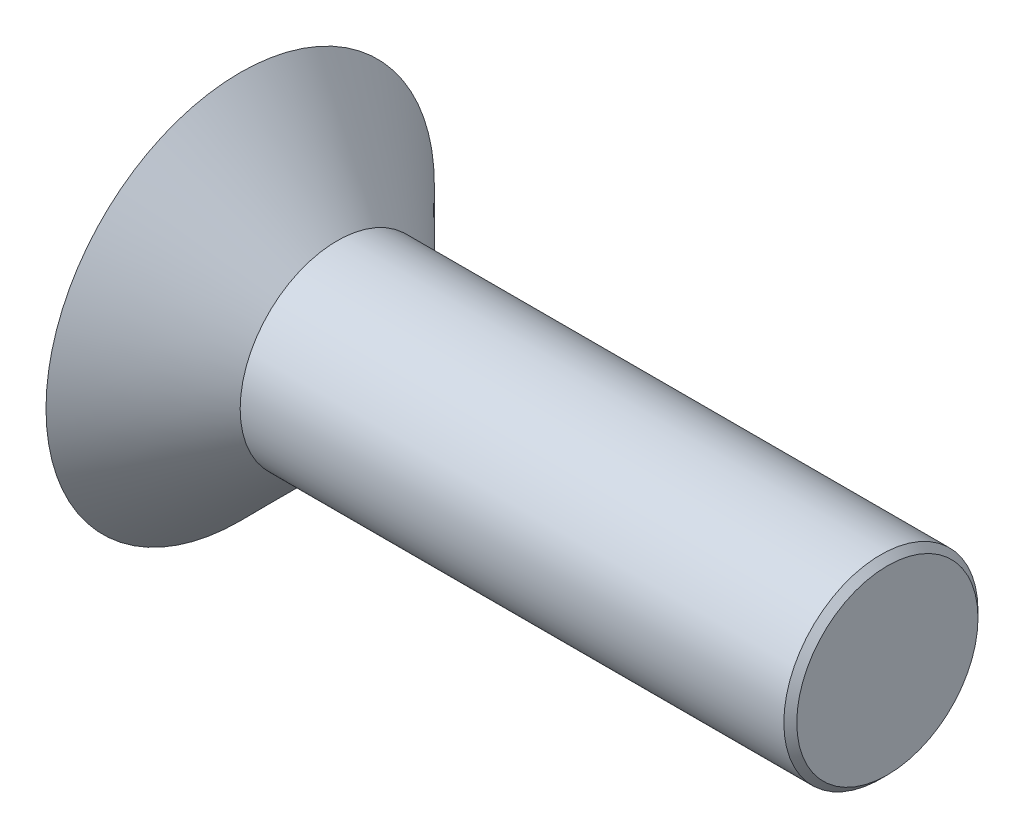
ISO-10303-21;
HEADER;
FILE_DESCRIPTION(('STEP AP214'),'2;1');
FILE_NAME('part.step','',(''),(''),'','','');
FILE_SCHEMA(('AUTOMOTIVE_DESIGN { 1 0 10303 214 1 1 1 1 }'));
ENDSEC;
DATA;
#1=APPLICATION_CONTEXT('core data for automotive mechanical design processes');
#2=APPLICATION_PROTOCOL_DEFINITION('international standard','automotive_design',2000,#1);
#3=PRODUCT_CONTEXT('',#1,'mechanical');
#4=PRODUCT('Part','Part','',(#3));
#5=PRODUCT_RELATED_PRODUCT_CATEGORY('part','',(#4));
#6=PRODUCT_DEFINITION_FORMATION('','',#4);
#7=PRODUCT_DEFINITION_CONTEXT('part definition',#1,'design');
#8=PRODUCT_DEFINITION('design','',#6,#7);
#9=PRODUCT_DEFINITION_SHAPE('','',#8);
#10=(LENGTH_UNIT() NAMED_UNIT(*) SI_UNIT(.MILLI.,.METRE.));
#11=(NAMED_UNIT(*) PLANE_ANGLE_UNIT() SI_UNIT($,.RADIAN.));
#12=(NAMED_UNIT(*) SI_UNIT($,.STERADIAN.) SOLID_ANGLE_UNIT());
#13=UNCERTAINTY_MEASURE_WITH_UNIT(LENGTH_MEASURE(1.E-05),#10,'distance_accuracy_value','');
#14=(GEOMETRIC_REPRESENTATION_CONTEXT(3) GLOBAL_UNCERTAINTY_ASSIGNED_CONTEXT((#13)) GLOBAL_UNIT_ASSIGNED_CONTEXT((#10,
#11,#12)) REPRESENTATION_CONTEXT('',''));
#15=CARTESIAN_POINT('',(0.,0.,0.));
#16=DIRECTION('',(0.,0.,1.));
#17=DIRECTION('',(1.,0.,0.));
#18=AXIS2_PLACEMENT_3D('',#15,#16,#17);
#19=CARTESIAN_POINT('',(0.,0.,0.));
#20=DIRECTION('',(1.,0.,0.));
#21=DIRECTION('',(0.,0.,1.));
#22=AXIS2_PLACEMENT_3D('',#19,#20,#21);
#23=PLANE('',#22);
#24=DIRECTION('',(0.,0.866025403784439,0.5));
#25=VECTOR('',#24,1.);
#26=CARTESIAN_POINT('',(0.,0.,-1.44337567297406));
#27=LINE('',#26,#25);
#28=CARTESIAN_POINT('',(0.,0.,-1.44337567297407));
#29=VERTEX_POINT('',#28);
#30=CARTESIAN_POINT('',(0.,1.25,-0.721687836487031));
#31=VERTEX_POINT('',#30);
#32=EDGE_CURVE('E259',#29,#31,#27,.T.);
#33=ORIENTED_EDGE('',*,*,#32,.T.);
#34=DIRECTION('',(0.,0.,1.));
#35=VECTOR('',#34,1.);
#36=CARTESIAN_POINT('',(0.,1.25,-0.721687836487031));
#37=LINE('',#36,#35);
#38=CARTESIAN_POINT('',(0.,1.25,0.721687836487033));
#39=VERTEX_POINT('',#38);
#40=EDGE_CURVE('E255',#31,#39,#37,.T.);
#41=ORIENTED_EDGE('',*,*,#40,.T.);
#42=DIRECTION('',(0.,-0.866025403784439,0.5));
#43=VECTOR('',#42,1.);
#44=CARTESIAN_POINT('',(0.,1.25,0.721687836487033));
#45=LINE('',#44,#43);
#46=CARTESIAN_POINT('',(0.,0.,1.44337567297407));
#47=VERTEX_POINT('',#46);
#48=EDGE_CURVE('E253',#39,#47,#45,.T.);
#49=ORIENTED_EDGE('',*,*,#48,.T.);
#50=DIRECTION('',(0.,-0.866025403784438,-0.5));
#51=VECTOR('',#50,1.);
#52=CARTESIAN_POINT('',(0.,0.,1.44337567297407));
#53=LINE('',#52,#51);
#54=CARTESIAN_POINT('',(0.,-1.25,0.721687836487033));
#55=VERTEX_POINT('',#54);
#56=EDGE_CURVE('E115',#47,#55,#53,.T.);
#57=ORIENTED_EDGE('',*,*,#56,.T.);
#58=DIRECTION('',(0.,0.,-1.));
#59=VECTOR('',#58,1.);
#60=CARTESIAN_POINT('',(0.,-1.25,0.721687836487033));
#61=LINE('',#60,#59);
#62=CARTESIAN_POINT('',(0.,-1.25,-0.721687836487032));
#63=VERTEX_POINT('',#62);
#64=EDGE_CURVE('E247',#55,#63,#61,.T.);
#65=ORIENTED_EDGE('',*,*,#64,.T.);
#66=DIRECTION('',(0.,0.866025403784438,-0.5));
#67=VECTOR('',#66,1.);
#68=CARTESIAN_POINT('',(0.,-1.25,-0.721687836487032));
#69=LINE('',#68,#67);
#70=EDGE_CURVE('E261',#63,#29,#69,.T.);
#71=ORIENTED_EDGE('',*,*,#70,.T.);
#72=EDGE_LOOP('',(#33,#41,#49,#57,#65,#71));
#73=FACE_BOUND('',#72,.T.);
#74=CARTESIAN_POINT('',(0.,0.,0.));
#75=DIRECTION('',(1.,0.,0.));
#76=DIRECTION('',(0.,0.,-1.));
#77=AXIS2_PLACEMENT_3D('',#74,#75,#76);
#78=CIRCLE('',#77,3.);
#79=CARTESIAN_POINT('',(0.,0.,-3.));
#80=VERTEX_POINT('',#79);
#81=EDGE_CURVE('E129',#80,#80,#78,.T.);
#82=ORIENTED_EDGE('',*,*,#81,.F.);
#83=EDGE_LOOP('',(#82));
#84=FACE_BOUND('',#83,.T.);
#85=ADVANCED_FACE('F37',(#73,#84),#23,.F.);
#86=CARTESIAN_POINT('',(1.49999999999999,0.,0.));
#87=DIRECTION('',(-1.,0.,0.));
#88=DIRECTION('',(0.,0.,-1.));
#89=AXIS2_PLACEMENT_3D('',#86,#87,#88);
#90=CONICAL_SURFACE('',#89,1.5,0.78539816339745);
#91=ORIENTED_EDGE('',*,*,#81,.T.);
#92=EDGE_LOOP('',(#91));
#93=FACE_BOUND('',#92,.T.);
#94=CARTESIAN_POINT('',(1.49999999999999,0.,0.));
#95=DIRECTION('',(1.,0.,0.));
#96=DIRECTION('',(0.,0.,-1.));
#97=AXIS2_PLACEMENT_3D('',#94,#95,#96);
#98=CIRCLE('',#97,1.5);
#99=CARTESIAN_POINT('',(1.49999999999999,0.,-1.5));
#100=VERTEX_POINT('',#99);
#101=EDGE_CURVE('E126',#100,#100,#98,.T.);
#102=ORIENTED_EDGE('',*,*,#101,.F.);
#103=EDGE_LOOP('',(#102));
#104=FACE_BOUND('',#103,.T.);
#105=ADVANCED_FACE('F139',(#93,#104),#90,.T.);
#106=CARTESIAN_POINT('',(0.,0.,0.));
#107=DIRECTION('',(-1.,0.,0.));
#108=DIRECTION('',(0.,0.,-1.));
#109=AXIS2_PLACEMENT_3D('',#106,#107,#108);
#110=CYLINDRICAL_SURFACE('',#109,1.5);
#111=CARTESIAN_POINT('',(9.9,0.,0.));
#112=DIRECTION('',(1.,0.,0.));
#113=DIRECTION('',(0.,0.,-1.));
#114=AXIS2_PLACEMENT_3D('',#111,#112,#113);
#115=CIRCLE('',#114,1.5);
#116=CARTESIAN_POINT('',(9.9,0.,-1.5));
#117=VERTEX_POINT('',#116);
#118=EDGE_CURVE('E45',#117,#117,#115,.T.);
#119=ORIENTED_EDGE('',*,*,#118,.F.);
#120=EDGE_LOOP('',(#119));
#121=FACE_BOUND('',#120,.T.);
#122=ORIENTED_EDGE('',*,*,#101,.T.);
#123=EDGE_LOOP('',(#122));
#124=FACE_BOUND('',#123,.T.);
#125=ADVANCED_FACE('F135',(#121,#124),#110,.T.);
#126=CARTESIAN_POINT('',(10.,0.,1.5));
#127=DIRECTION('',(-1.,0.,0.));
#128=DIRECTION('',(0.,0.,-1.));
#129=AXIS2_PLACEMENT_3D('',#126,#127,#128);
#130=PLANE('',#129);
#131=CARTESIAN_POINT('',(10.,0.,0.));
#132=DIRECTION('',(1.,0.,0.));
#133=DIRECTION('',(0.,0.,-1.));
#134=AXIS2_PLACEMENT_3D('',#131,#132,#133);
#135=CIRCLE('',#134,1.4);
#136=CARTESIAN_POINT('',(10.,0.,-1.4));
#137=VERTEX_POINT('',#136);
#138=EDGE_CURVE('E11',#137,#137,#135,.F.);
#139=ORIENTED_EDGE('',*,*,#138,.F.);
#140=EDGE_LOOP('',(#139));
#141=FACE_BOUND('',#140,.T.);
#142=ADVANCED_FACE('F138',(#141),#130,.F.);
#143=CARTESIAN_POINT('',(1.2,-1.25,-0.721687836487032));
#144=DIRECTION('',(0.,-0.5,-0.866025403784439));
#145=DIRECTION('',(0.,-0.866025403784439,0.5));
#146=AXIS2_PLACEMENT_3D('',#143,#144,#145);
#147=PLANE('',#146);
#148=ORIENTED_EDGE('',*,*,#70,.F.);
#149=DIRECTION('',(-1.,0.,0.));
#150=VECTOR('',#149,1.);
#151=CARTESIAN_POINT('',(1.2,-1.25,-0.721687836487032));
#152=LINE('',#151,#150);
#153=CARTESIAN_POINT('',(1.2,-1.25,-0.721687836487032));
#154=VERTEX_POINT('',#153);
#155=EDGE_CURVE('E83',#154,#63,#152,.T.);
#156=ORIENTED_EDGE('',*,*,#155,.F.);
#157=DIRECTION('',(0.,0.866025403784438,-0.5));
#158=VECTOR('',#157,1.);
#159=CARTESIAN_POINT('',(1.2,-1.25,-0.721687836487032));
#160=LINE('',#159,#158);
#161=CARTESIAN_POINT('',(1.2,0.,-1.44337567297406));
#162=VERTEX_POINT('',#161);
#163=EDGE_CURVE('E248',#154,#162,#160,.T.);
#164=ORIENTED_EDGE('',*,*,#163,.T.);
#165=DIRECTION('',(-1.,0.,0.));
#166=VECTOR('',#165,1.);
#167=CARTESIAN_POINT('',(1.2,0.,-1.44337567297406));
#168=LINE('',#167,#166);
#169=EDGE_CURVE('E52',#162,#29,#168,.T.);
#170=ORIENTED_EDGE('',*,*,#169,.T.);
#171=EDGE_LOOP('',(#148,#156,#164,#170));
#172=FACE_BOUND('',#171,.T.);
#173=ADVANCED_FACE('F153',(#172),#147,.F.);
#174=CARTESIAN_POINT('',(1.2,-1.25,0.721687836487033));
#175=DIRECTION('',(0.,-1.,0.));
#176=DIRECTION('',(0.,0.,1.));
#177=AXIS2_PLACEMENT_3D('',#174,#175,#176);
#178=PLANE('',#177);
#179=ORIENTED_EDGE('',*,*,#64,.F.);
#180=DIRECTION('',(-1.,0.,0.));
#181=VECTOR('',#180,1.);
#182=CARTESIAN_POINT('',(1.2,-1.25,0.721687836487033));
#183=LINE('',#182,#181);
#184=CARTESIAN_POINT('',(1.2,-1.25,0.721687836487033));
#185=VERTEX_POINT('',#184);
#186=EDGE_CURVE('E117',#185,#55,#183,.T.);
#187=ORIENTED_EDGE('',*,*,#186,.F.);
#188=DIRECTION('',(0.,0.,-1.));
#189=VECTOR('',#188,1.);
#190=CARTESIAN_POINT('',(1.2,-1.25,0.721687836487033));
#191=LINE('',#190,#189);
#192=EDGE_CURVE('E61',#185,#154,#191,.T.);
#193=ORIENTED_EDGE('',*,*,#192,.T.);
#194=ORIENTED_EDGE('',*,*,#155,.T.);
#195=EDGE_LOOP('',(#179,#187,#193,#194));
#196=FACE_BOUND('',#195,.T.);
#197=ADVANCED_FACE('F157',(#196),#178,.F.);
#198=CARTESIAN_POINT('',(1.2,0.,1.44337567297407));
#199=DIRECTION('',(0.,-0.5,0.866025403784439));
#200=DIRECTION('',(0.,0.866025403784439,0.5));
#201=AXIS2_PLACEMENT_3D('',#198,#199,#200);
#202=PLANE('',#201);
#203=ORIENTED_EDGE('',*,*,#56,.F.);
#204=DIRECTION('',(-1.,0.,0.));
#205=VECTOR('',#204,1.);
#206=CARTESIAN_POINT('',(1.2,0.,1.44337567297407));
#207=LINE('',#206,#205);
#208=CARTESIAN_POINT('',(1.2,0.,1.44337567297407));
#209=VERTEX_POINT('',#208);
#210=EDGE_CURVE('E104',#209,#47,#207,.T.);
#211=ORIENTED_EDGE('',*,*,#210,.F.);
#212=DIRECTION('',(0.,-0.866025403784438,-0.5));
#213=VECTOR('',#212,1.);
#214=CARTESIAN_POINT('',(1.2,0.,1.44337567297407));
#215=LINE('',#214,#213);
#216=EDGE_CURVE('E107',#209,#185,#215,.T.);
#217=ORIENTED_EDGE('',*,*,#216,.T.);
#218=ORIENTED_EDGE('',*,*,#186,.T.);
#219=EDGE_LOOP('',(#203,#211,#217,#218));
#220=FACE_BOUND('',#219,.T.);
#221=ADVANCED_FACE('F113',(#220),#202,.F.);
#222=CARTESIAN_POINT('',(1.2,1.25,0.721687836487033));
#223=DIRECTION('',(0.,0.5,0.866025403784439));
#224=DIRECTION('',(0.,0.866025403784439,-0.5));
#225=AXIS2_PLACEMENT_3D('',#222,#223,#224);
#226=PLANE('',#225);
#227=ORIENTED_EDGE('',*,*,#48,.F.);
#228=DIRECTION('',(-1.,0.,0.));
#229=VECTOR('',#228,1.);
#230=CARTESIAN_POINT('',(1.2,1.25,0.721687836487033));
#231=LINE('',#230,#229);
#232=CARTESIAN_POINT('',(1.2,1.25,0.721687836487033));
#233=VERTEX_POINT('',#232);
#234=EDGE_CURVE('E106',#233,#39,#231,.T.);
#235=ORIENTED_EDGE('',*,*,#234,.F.);
#236=DIRECTION('',(0.,-0.866025403784439,0.5));
#237=VECTOR('',#236,1.);
#238=CARTESIAN_POINT('',(1.2,1.25,0.721687836487033));
#239=LINE('',#238,#237);
#240=EDGE_CURVE('E99',#233,#209,#239,.T.);
#241=ORIENTED_EDGE('',*,*,#240,.T.);
#242=ORIENTED_EDGE('',*,*,#210,.T.);
#243=EDGE_LOOP('',(#227,#235,#241,#242));
#244=FACE_BOUND('',#243,.T.);
#245=ADVANCED_FACE('F102',(#244),#226,.F.);
#246=CARTESIAN_POINT('',(1.2,1.25,-0.721687836487031));
#247=DIRECTION('',(0.,1.,0.));
#248=DIRECTION('',(0.,0.,-1.));
#249=AXIS2_PLACEMENT_3D('',#246,#247,#248);
#250=PLANE('',#249);
#251=ORIENTED_EDGE('',*,*,#40,.F.);
#252=DIRECTION('',(-1.,0.,0.));
#253=VECTOR('',#252,1.);
#254=CARTESIAN_POINT('',(1.2,1.25,-0.721687836487031));
#255=LINE('',#254,#253);
#256=CARTESIAN_POINT('',(1.2,1.25,-0.721687836487031));
#257=VERTEX_POINT('',#256);
#258=EDGE_CURVE('E120',#257,#31,#255,.T.);
#259=ORIENTED_EDGE('',*,*,#258,.F.);
#260=DIRECTION('',(0.,0.,1.));
#261=VECTOR('',#260,1.);
#262=CARTESIAN_POINT('',(1.2,1.25,-0.721687836487031));
#263=LINE('',#262,#261);
#264=EDGE_CURVE('E108',#257,#233,#263,.T.);
#265=ORIENTED_EDGE('',*,*,#264,.T.);
#266=ORIENTED_EDGE('',*,*,#234,.T.);
#267=EDGE_LOOP('',(#251,#259,#265,#266));
#268=FACE_BOUND('',#267,.T.);
#269=ADVANCED_FACE('F161',(#268),#250,.F.);
#270=CARTESIAN_POINT('',(1.2,0.,-1.44337567297406));
#271=DIRECTION('',(0.,0.5,-0.866025403784438));
#272=DIRECTION('',(0.,-0.866025403784439,-0.5));
#273=AXIS2_PLACEMENT_3D('',#270,#271,#272);
#274=PLANE('',#273);
#275=ORIENTED_EDGE('',*,*,#32,.F.);
#276=ORIENTED_EDGE('',*,*,#169,.F.);
#277=DIRECTION('',(0.,0.866025403784439,0.5));
#278=VECTOR('',#277,1.);
#279=CARTESIAN_POINT('',(1.2,0.,-1.44337567297406));
#280=LINE('',#279,#278);
#281=EDGE_CURVE('E90',#162,#257,#280,.T.);
#282=ORIENTED_EDGE('',*,*,#281,.T.);
#283=ORIENTED_EDGE('',*,*,#258,.T.);
#284=EDGE_LOOP('',(#275,#276,#282,#283));
#285=FACE_BOUND('',#284,.T.);
#286=ADVANCED_FACE('F158',(#285),#274,.F.);
#287=CARTESIAN_POINT('',(1.2,0.,0.));
#288=DIRECTION('',(-1.,0.,0.));
#289=DIRECTION('',(0.,0.,-1.));
#290=AXIS2_PLACEMENT_3D('',#287,#288,#289);
#291=PLANE('',#290);
#292=ORIENTED_EDGE('',*,*,#163,.F.);
#293=ORIENTED_EDGE('',*,*,#192,.F.);
#294=ORIENTED_EDGE('',*,*,#216,.F.);
#295=ORIENTED_EDGE('',*,*,#240,.F.);
#296=ORIENTED_EDGE('',*,*,#264,.F.);
#297=ORIENTED_EDGE('',*,*,#281,.F.);
#298=EDGE_LOOP('',(#292,#293,#294,#295,#296,#297));
#299=FACE_BOUND('',#298,.T.);
#300=ADVANCED_FACE('F110',(#299),#291,.T.);
#301=CARTESIAN_POINT('',(9.9,0.,0.));
#302=DIRECTION('',(-1.,0.,0.));
#303=DIRECTION('',(0.,0.,-1.));
#304=AXIS2_PLACEMENT_3D('',#301,#302,#303);
#305=CONICAL_SURFACE('',#304,1.5,0.785398163397443);
#306=ORIENTED_EDGE('',*,*,#138,.T.);
#307=EDGE_LOOP('',(#306));
#308=FACE_BOUND('',#307,.T.);
#309=ORIENTED_EDGE('',*,*,#118,.T.);
#310=EDGE_LOOP('',(#309));
#311=FACE_BOUND('',#310,.T.);
#312=ADVANCED_FACE('F39',(#308,#311),#305,.T.);
#313=CLOSED_SHELL('',(#85,#105,#125,#142,#173,#197,#221,#245,#269,#286,#300,#312));
#314=MANIFOLD_SOLID_BREP('B2',#313);
#315=ADVANCED_BREP_SHAPE_REPRESENTATION('',(#18,#314),#14);
#316=SHAPE_DEFINITION_REPRESENTATION(#9,#315);
ENDSEC;
END-ISO-10303-21;
